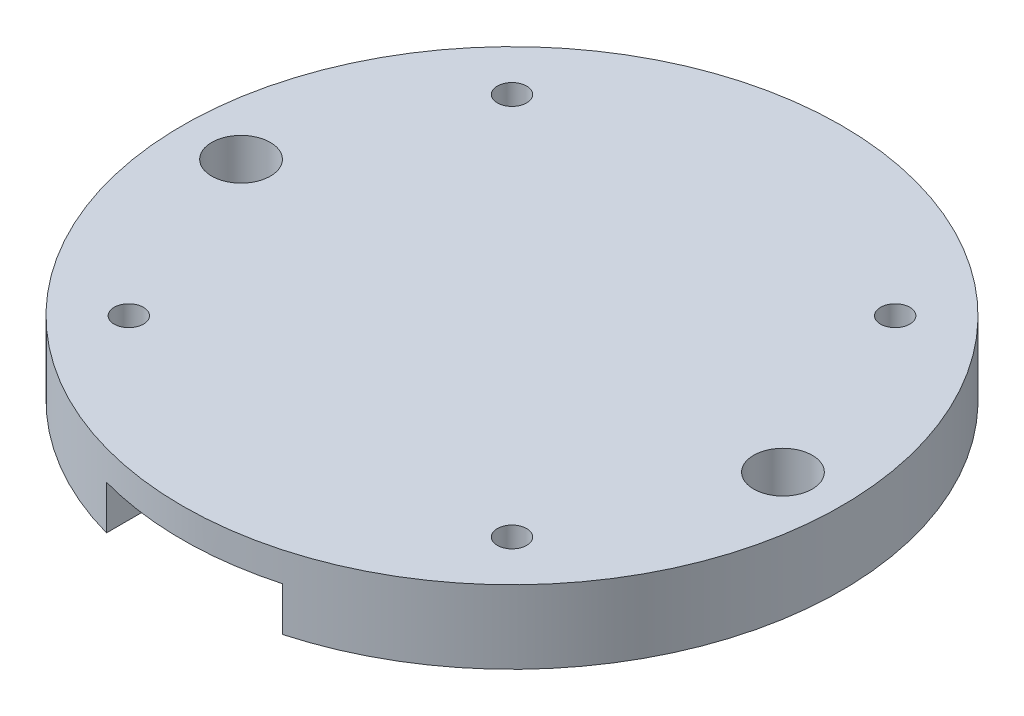
ISO-10303-21;
HEADER;
FILE_DESCRIPTION(('STEP AP214'),'2;1');
FILE_NAME('part.step','',(''),(''),'','','');
FILE_SCHEMA(('AUTOMOTIVE_DESIGN { 1 0 10303 214 1 1 1 1 }'));
ENDSEC;
DATA;
#1=APPLICATION_CONTEXT('core data for automotive mechanical design processes');
#2=APPLICATION_PROTOCOL_DEFINITION('international standard','automotive_design',2000,#1);
#3=PRODUCT_CONTEXT('',#1,'mechanical');
#4=PRODUCT('Part','Part','',(#3));
#5=PRODUCT_RELATED_PRODUCT_CATEGORY('part','',(#4));
#6=PRODUCT_DEFINITION_FORMATION('','',#4);
#7=PRODUCT_DEFINITION_CONTEXT('part definition',#1,'design');
#8=PRODUCT_DEFINITION('design','',#6,#7);
#9=PRODUCT_DEFINITION_SHAPE('','',#8);
#10=(LENGTH_UNIT() NAMED_UNIT(*) SI_UNIT(.MILLI.,.METRE.));
#11=(NAMED_UNIT(*) PLANE_ANGLE_UNIT() SI_UNIT($,.RADIAN.));
#12=(NAMED_UNIT(*) SI_UNIT($,.STERADIAN.) SOLID_ANGLE_UNIT());
#13=UNCERTAINTY_MEASURE_WITH_UNIT(LENGTH_MEASURE(1.E-05),#10,'distance_accuracy_value','');
#14=(GEOMETRIC_REPRESENTATION_CONTEXT(3) GLOBAL_UNCERTAINTY_ASSIGNED_CONTEXT((#13)) GLOBAL_UNIT_ASSIGNED_CONTEXT((#10,
#11,#12)) REPRESENTATION_CONTEXT('',''));
#15=CARTESIAN_POINT('',(0.,0.,0.));
#16=DIRECTION('',(0.,0.,1.));
#17=DIRECTION('',(1.,0.,0.));
#18=AXIS2_PLACEMENT_3D('',#15,#16,#17);
#19=CARTESIAN_POINT('',(0.,0.,0.));
#20=DIRECTION('',(0.,1.,0.));
#21=DIRECTION('',(0.,0.,1.));
#22=AXIS2_PLACEMENT_3D('',#19,#20,#21);
#23=PLANE('',#22);
#24=CARTESIAN_POINT('',(13.0814754519511,0.,13.0814754519512));
#25=DIRECTION('',(0.,1.,0.));
#26=DIRECTION('',(0.,0.,-1.));
#27=AXIS2_PLACEMENT_3D('',#24,#25,#26);
#28=CIRCLE('',#27,1.00000000000002);
#29=CARTESIAN_POINT('',(13.0814754519511,0.,14.0814754519512));
#30=VERTEX_POINT('',#29);
#31=EDGE_CURVE('E227',#30,#30,#28,.T.);
#32=ORIENTED_EDGE('',*,*,#31,.T.);
#33=EDGE_LOOP('',(#32));
#34=FACE_BOUND('',#33,.T.);
#35=CARTESIAN_POINT('',(13.0814754519511,0.,-13.0814754519512));
#36=DIRECTION('',(0.,1.,0.));
#37=DIRECTION('',(0.,0.,1.));
#38=AXIS2_PLACEMENT_3D('',#35,#36,#37);
#39=CIRCLE('',#38,1.00000000000002);
#40=CARTESIAN_POINT('',(13.0814754519511,0.,-12.0814754519511));
#41=VERTEX_POINT('',#40);
#42=EDGE_CURVE('E146',#41,#41,#39,.T.);
#43=ORIENTED_EDGE('',*,*,#42,.T.);
#44=EDGE_LOOP('',(#43));
#45=FACE_BOUND('',#44,.T.);
#46=CARTESIAN_POINT('',(18.5,0.,0.));
#47=DIRECTION('',(0.,1.,0.));
#48=DIRECTION('',(0.,0.,1.));
#49=AXIS2_PLACEMENT_3D('',#46,#47,#48);
#50=CIRCLE('',#49,2.);
#51=CARTESIAN_POINT('',(18.5,0.,2.));
#52=VERTEX_POINT('',#51);
#53=EDGE_CURVE('E125',#52,#52,#50,.T.);
#54=ORIENTED_EDGE('',*,*,#53,.T.);
#55=EDGE_LOOP('',(#54));
#56=FACE_BOUND('',#55,.T.);
#57=CARTESIAN_POINT('',(0.,0.,0.));
#58=DIRECTION('',(0.,1.,0.));
#59=DIRECTION('',(0.,0.,1.));
#60=AXIS2_PLACEMENT_3D('',#57,#58,#59);
#61=CIRCLE('',#60,22.5);
#62=CARTESIAN_POINT('',(6.,0.,21.6852484422014));
#63=VERTEX_POINT('',#62);
#64=CARTESIAN_POINT('',(6.,0.,-21.6852484422014));
#65=VERTEX_POINT('',#64);
#66=EDGE_CURVE('E119',#63,#65,#61,.T.);
#67=ORIENTED_EDGE('',*,*,#66,.F.);
#68=DIRECTION('',(0.,0.,1.));
#69=VECTOR('',#68,1.);
#70=CARTESIAN_POINT('',(6.,0.,-22.5));
#71=LINE('',#70,#69);
#72=CARTESIAN_POINT('',(6.,0.,8.31038506929733));
#73=VERTEX_POINT('',#72);
#74=EDGE_CURVE('E107',#73,#63,#71,.T.);
#75=ORIENTED_EDGE('',*,*,#74,.F.);
#76=CARTESIAN_POINT('',(0.,0.,0.));
#77=DIRECTION('',(0.,1.,0.));
#78=DIRECTION('',(0.,0.,1.));
#79=AXIS2_PLACEMENT_3D('',#76,#77,#78);
#80=CIRCLE('',#79,10.25);
#81=CARTESIAN_POINT('',(6.,0.,-8.31038506929733));
#82=VERTEX_POINT('',#81);
#83=EDGE_CURVE('E165',#73,#82,#80,.T.);
#84=ORIENTED_EDGE('',*,*,#83,.T.);
#85=EDGE_CURVE('E151',#65,#82,#71,.T.);
#86=ORIENTED_EDGE('',*,*,#85,.F.);
#87=EDGE_LOOP('',(#67,#75,#84,#86));
#88=FACE_BOUND('',#87,.T.);
#89=ADVANCED_FACE('F32',(#34,#45,#56,#88),#23,.F.);
#90=CARTESIAN_POINT('',(0.,1.,0.));
#91=DIRECTION('',(0.,-1.,0.));
#92=DIRECTION('',(0.,0.,-1.));
#93=AXIS2_PLACEMENT_3D('',#90,#91,#92);
#94=CYLINDRICAL_SURFACE('',#93,10.25);
#95=DIRECTION('',(0.,-1.,0.));
#96=VECTOR('',#95,1.);
#97=CARTESIAN_POINT('',(6.,1.,8.31038506929733));
#98=LINE('',#97,#96);
#99=CARTESIAN_POINT('',(6.,1.,8.31038506929733));
#100=VERTEX_POINT('',#99);
#101=EDGE_CURVE('E155',#100,#73,#98,.T.);
#102=ORIENTED_EDGE('',*,*,#101,.F.);
#103=CARTESIAN_POINT('',(0.,1.,0.));
#104=DIRECTION('',(0.,1.,0.));
#105=DIRECTION('',(0.,0.,1.));
#106=AXIS2_PLACEMENT_3D('',#103,#104,#105);
#107=CIRCLE('',#106,10.25);
#108=CARTESIAN_POINT('',(6.,1.,-8.31038506929733));
#109=VERTEX_POINT('',#108);
#110=EDGE_CURVE('E161',#100,#109,#107,.T.);
#111=ORIENTED_EDGE('',*,*,#110,.T.);
#112=DIRECTION('',(0.,-1.,0.));
#113=VECTOR('',#112,1.);
#114=CARTESIAN_POINT('',(6.,1.,-8.31038506929733));
#115=LINE('',#114,#113);
#116=EDGE_CURVE('E55',#82,#109,#115,.F.);
#117=ORIENTED_EDGE('',*,*,#116,.F.);
#118=ORIENTED_EDGE('',*,*,#83,.F.);
#119=EDGE_LOOP('',(#102,#111,#117,#118));
#120=FACE_BOUND('',#119,.T.);
#121=ADVANCED_FACE('F193',(#120),#94,.F.);
#122=CARTESIAN_POINT('',(0.,1.,0.));
#123=DIRECTION('',(0.,1.,0.));
#124=DIRECTION('',(0.,0.,1.));
#125=AXIS2_PLACEMENT_3D('',#122,#123,#124);
#126=PLANE('',#125);
#127=ORIENTED_EDGE('',*,*,#110,.F.);
#128=DIRECTION('',(0.,0.,-1.));
#129=VECTOR('',#128,1.);
#130=CARTESIAN_POINT('',(6.,1.,0.));
#131=LINE('',#130,#129);
#132=EDGE_CURVE('E131',#100,#109,#131,.T.);
#133=ORIENTED_EDGE('',*,*,#132,.T.);
#134=EDGE_LOOP('',(#127,#133));
#135=FACE_BOUND('',#134,.T.);
#136=ADVANCED_FACE('F198',(#135),#126,.F.);
#137=CARTESIAN_POINT('',(-13.0814754519511,0.,13.0814754519512));
#138=DIRECTION('',(0.,1.,0.));
#139=DIRECTION('',(0.,0.,1.));
#140=AXIS2_PLACEMENT_3D('',#137,#138,#139);
#141=CIRCLE('',#140,1.00000000000002);
#142=CARTESIAN_POINT('',(-13.0814754519511,0.,14.0814754519512));
#143=VERTEX_POINT('',#142);
#144=EDGE_CURVE('E215',#143,#143,#141,.T.);
#145=ORIENTED_EDGE('',*,*,#144,.T.);
#146=EDGE_LOOP('',(#145));
#147=FACE_BOUND('',#146,.T.);
#148=CARTESIAN_POINT('',(-13.0814754519511,0.,-13.0814754519512));
#149=DIRECTION('',(0.,1.,0.));
#150=DIRECTION('',(0.,0.,-1.));
#151=AXIS2_PLACEMENT_3D('',#148,#149,#150);
#152=CIRCLE('',#151,1.00000000000002);
#153=CARTESIAN_POINT('',(-13.0814754519511,0.,-12.0814754519511));
#154=VERTEX_POINT('',#153);
#155=EDGE_CURVE('E219',#154,#154,#152,.T.);
#156=ORIENTED_EDGE('',*,*,#155,.T.);
#157=EDGE_LOOP('',(#156));
#158=FACE_BOUND('',#157,.T.);
#159=CARTESIAN_POINT('',(-18.5,0.,0.));
#160=DIRECTION('',(0.,1.,0.));
#161=DIRECTION('',(0.,0.,-1.));
#162=AXIS2_PLACEMENT_3D('',#159,#160,#161);
#163=CIRCLE('',#162,2.);
#164=CARTESIAN_POINT('',(-18.5,0.,-2.));
#165=VERTEX_POINT('',#164);
#166=EDGE_CURVE('E163',#165,#165,#163,.T.);
#167=ORIENTED_EDGE('',*,*,#166,.T.);
#168=EDGE_LOOP('',(#167));
#169=FACE_BOUND('',#168,.T.);
#170=CARTESIAN_POINT('',(-6.,0.,-21.6852484422014));
#171=VERTEX_POINT('',#170);
#172=CARTESIAN_POINT('',(-6.,0.,21.6852484422014));
#173=VERTEX_POINT('',#172);
#174=EDGE_CURVE('E113',#171,#173,#61,.T.);
#175=ORIENTED_EDGE('',*,*,#174,.F.);
#176=DIRECTION('',(0.,0.,1.));
#177=VECTOR('',#176,1.);
#178=CARTESIAN_POINT('',(-6.,0.,-22.5));
#179=LINE('',#178,#177);
#180=CARTESIAN_POINT('',(-6.,0.,-8.31038506929734));
#181=VERTEX_POINT('',#180);
#182=EDGE_CURVE('E95',#171,#181,#179,.T.);
#183=ORIENTED_EDGE('',*,*,#182,.T.);
#184=CARTESIAN_POINT('',(-6.,0.,8.31038506929733));
#185=VERTEX_POINT('',#184);
#186=EDGE_CURVE('E160',#181,#185,#80,.T.);
#187=ORIENTED_EDGE('',*,*,#186,.T.);
#188=EDGE_CURVE('E108',#185,#173,#179,.T.);
#189=ORIENTED_EDGE('',*,*,#188,.T.);
#190=EDGE_LOOP('',(#175,#183,#187,#189));
#191=FACE_BOUND('',#190,.T.);
#192=ADVANCED_FACE('F118',(#147,#158,#169,#191),#23,.F.);
#193=CARTESIAN_POINT('',(0.,5.,0.));
#194=DIRECTION('',(0.,1.,0.));
#195=DIRECTION('',(0.,0.,1.));
#196=AXIS2_PLACEMENT_3D('',#193,#194,#195);
#197=PLANE('',#196);
#198=CARTESIAN_POINT('',(-13.0814754519511,5.,13.0814754519512));
#199=DIRECTION('',(0.,1.,0.));
#200=DIRECTION('',(0.,0.,1.));
#201=AXIS2_PLACEMENT_3D('',#198,#199,#200);
#202=CIRCLE('',#201,1.00000000000002);
#203=CARTESIAN_POINT('',(-13.0814754519511,5.,14.0814754519512));
#204=VERTEX_POINT('',#203);
#205=EDGE_CURVE('E232',#204,#204,#202,.T.);
#206=ORIENTED_EDGE('',*,*,#205,.F.);
#207=EDGE_LOOP('',(#206));
#208=FACE_BOUND('',#207,.T.);
#209=CARTESIAN_POINT('',(-13.0814754519511,5.,-13.0814754519512));
#210=DIRECTION('',(0.,1.,0.));
#211=DIRECTION('',(0.,0.,-1.));
#212=AXIS2_PLACEMENT_3D('',#209,#210,#211);
#213=CIRCLE('',#212,1.00000000000002);
#214=CARTESIAN_POINT('',(-13.0814754519511,5.,-12.0814754519511));
#215=VERTEX_POINT('',#214);
#216=EDGE_CURVE('E224',#215,#215,#213,.T.);
#217=ORIENTED_EDGE('',*,*,#216,.F.);
#218=EDGE_LOOP('',(#217));
#219=FACE_BOUND('',#218,.T.);
#220=CARTESIAN_POINT('',(13.0814754519511,5.,13.0814754519512));
#221=DIRECTION('',(0.,1.,0.));
#222=DIRECTION('',(0.,0.,-1.));
#223=AXIS2_PLACEMENT_3D('',#220,#221,#222);
#224=CIRCLE('',#223,1.00000000000002);
#225=CARTESIAN_POINT('',(13.0814754519511,5.,14.0814754519512));
#226=VERTEX_POINT('',#225);
#227=EDGE_CURVE('E223',#226,#226,#224,.T.);
#228=ORIENTED_EDGE('',*,*,#227,.F.);
#229=EDGE_LOOP('',(#228));
#230=FACE_BOUND('',#229,.T.);
#231=CARTESIAN_POINT('',(13.0814754519511,5.,-13.0814754519512));
#232=DIRECTION('',(0.,1.,0.));
#233=DIRECTION('',(0.,0.,1.));
#234=AXIS2_PLACEMENT_3D('',#231,#232,#233);
#235=CIRCLE('',#234,1.00000000000002);
#236=CARTESIAN_POINT('',(13.0814754519511,5.,-12.0814754519511));
#237=VERTEX_POINT('',#236);
#238=EDGE_CURVE('E235',#237,#237,#235,.T.);
#239=ORIENTED_EDGE('',*,*,#238,.F.);
#240=EDGE_LOOP('',(#239));
#241=FACE_BOUND('',#240,.T.);
#242=CARTESIAN_POINT('',(18.5,5.,0.));
#243=DIRECTION('',(0.,1.,0.));
#244=DIRECTION('',(0.,0.,1.));
#245=AXIS2_PLACEMENT_3D('',#242,#243,#244);
#246=CIRCLE('',#245,2.);
#247=CARTESIAN_POINT('',(18.5,5.,2.));
#248=VERTEX_POINT('',#247);
#249=EDGE_CURVE('E120',#248,#248,#246,.T.);
#250=ORIENTED_EDGE('',*,*,#249,.F.);
#251=EDGE_LOOP('',(#250));
#252=FACE_BOUND('',#251,.T.);
#253=CARTESIAN_POINT('',(0.,5.,0.));
#254=DIRECTION('',(0.,1.,0.));
#255=DIRECTION('',(0.,0.,1.));
#256=AXIS2_PLACEMENT_3D('',#253,#254,#255);
#257=CIRCLE('',#256,22.5);
#258=CARTESIAN_POINT('',(0.,5.,22.5));
#259=VERTEX_POINT('',#258);
#260=EDGE_CURVE('E123',#259,#259,#257,.T.);
#261=ORIENTED_EDGE('',*,*,#260,.T.);
#262=EDGE_LOOP('',(#261));
#263=FACE_BOUND('',#262,.T.);
#264=CARTESIAN_POINT('',(-18.5,5.,0.));
#265=DIRECTION('',(0.,1.,0.));
#266=DIRECTION('',(0.,0.,-1.));
#267=AXIS2_PLACEMENT_3D('',#264,#265,#266);
#268=CIRCLE('',#267,2.);
#269=CARTESIAN_POINT('',(-18.5,5.,-2.));
#270=VERTEX_POINT('',#269);
#271=EDGE_CURVE('E168',#270,#270,#268,.T.);
#272=ORIENTED_EDGE('',*,*,#271,.F.);
#273=EDGE_LOOP('',(#272));
#274=FACE_BOUND('',#273,.T.);
#275=ADVANCED_FACE('F189',(#208,#219,#230,#241,#252,#263,#274),#197,.T.);
#276=CARTESIAN_POINT('',(0.,5.,0.));
#277=DIRECTION('',(0.,-1.,0.));
#278=DIRECTION('',(0.,0.,-1.));
#279=AXIS2_PLACEMENT_3D('',#276,#277,#278);
#280=CYLINDRICAL_SURFACE('',#279,22.5);
#281=ORIENTED_EDGE('',*,*,#260,.F.);
#282=EDGE_LOOP('',(#281));
#283=FACE_BOUND('',#282,.T.);
#284=ORIENTED_EDGE('',*,*,#174,.T.);
#285=DIRECTION('',(0.,-1.,0.));
#286=VECTOR('',#285,1.);
#287=CARTESIAN_POINT('',(-6.,5.,21.6852484422014));
#288=LINE('',#287,#286);
#289=CARTESIAN_POINT('',(-5.99999999999999,3.,21.6852484422014));
#290=VERTEX_POINT('',#289);
#291=EDGE_CURVE('E115',#173,#290,#288,.F.);
#292=ORIENTED_EDGE('',*,*,#291,.T.);
#293=CARTESIAN_POINT('',(0.,3.,0.));
#294=DIRECTION('',(0.,1.,0.));
#295=DIRECTION('',(-1.,0.,0.));
#296=AXIS2_PLACEMENT_3D('',#293,#294,#295);
#297=CIRCLE('',#296,22.5);
#298=CARTESIAN_POINT('',(6.,3.,21.6852484422014));
#299=VERTEX_POINT('',#298);
#300=EDGE_CURVE('E36',#290,#299,#297,.T.);
#301=ORIENTED_EDGE('',*,*,#300,.T.);
#302=DIRECTION('',(0.,-1.,0.));
#303=VECTOR('',#302,1.);
#304=CARTESIAN_POINT('',(6.,5.,21.6852484422014));
#305=LINE('',#304,#303);
#306=EDGE_CURVE('E137',#299,#63,#305,.T.);
#307=ORIENTED_EDGE('',*,*,#306,.T.);
#308=ORIENTED_EDGE('',*,*,#66,.T.);
#309=DIRECTION('',(0.,-1.,0.));
#310=VECTOR('',#309,1.);
#311=CARTESIAN_POINT('',(6.,5.,-21.6852484422014));
#312=LINE('',#311,#310);
#313=CARTESIAN_POINT('',(6.,3.,-21.6852484422014));
#314=VERTEX_POINT('',#313);
#315=EDGE_CURVE('E157',#65,#314,#312,.F.);
#316=ORIENTED_EDGE('',*,*,#315,.T.);
#317=CARTESIAN_POINT('',(-5.99999999999999,3.,-21.6852484422014));
#318=VERTEX_POINT('',#317);
#319=EDGE_CURVE('E11',#314,#318,#297,.T.);
#320=ORIENTED_EDGE('',*,*,#319,.T.);
#321=DIRECTION('',(0.,-1.,0.));
#322=VECTOR('',#321,1.);
#323=CARTESIAN_POINT('',(-6.,5.,-21.6852484422014));
#324=LINE('',#323,#322);
#325=EDGE_CURVE('E99',#318,#171,#324,.T.);
#326=ORIENTED_EDGE('',*,*,#325,.T.);
#327=EDGE_LOOP('',(#284,#292,#301,#307,#308,#316,#320,#326));
#328=FACE_BOUND('',#327,.T.);
#329=ADVANCED_FACE('F34',(#283,#328),#280,.T.);
#330=CARTESIAN_POINT('',(18.5,5.,0.));
#331=DIRECTION('',(0.,-1.,0.));
#332=DIRECTION('',(0.,0.,-1.));
#333=AXIS2_PLACEMENT_3D('',#330,#331,#332);
#334=CYLINDRICAL_SURFACE('',#333,2.);
#335=ORIENTED_EDGE('',*,*,#249,.T.);
#336=EDGE_LOOP('',(#335));
#337=FACE_BOUND('',#336,.T.);
#338=ORIENTED_EDGE('',*,*,#53,.F.);
#339=EDGE_LOOP('',(#338));
#340=FACE_BOUND('',#339,.T.);
#341=ADVANCED_FACE('F177',(#337,#340),#334,.F.);
#342=CARTESIAN_POINT('',(-18.5,5.,0.));
#343=DIRECTION('',(0.,-1.,0.));
#344=DIRECTION('',(0.,0.,-1.));
#345=AXIS2_PLACEMENT_3D('',#342,#343,#344);
#346=CYLINDRICAL_SURFACE('',#345,2.);
#347=ORIENTED_EDGE('',*,*,#271,.T.);
#348=EDGE_LOOP('',(#347));
#349=FACE_BOUND('',#348,.T.);
#350=ORIENTED_EDGE('',*,*,#166,.F.);
#351=EDGE_LOOP('',(#350));
#352=FACE_BOUND('',#351,.T.);
#353=ADVANCED_FACE('F179',(#349,#352),#346,.F.);
#354=DIRECTION('',(0.,-1.,0.));
#355=VECTOR('',#354,1.);
#356=CARTESIAN_POINT('',(-6.,1.,-8.31038506929733));
#357=LINE('',#356,#355);
#358=CARTESIAN_POINT('',(-6.,1.,-8.31038506929733));
#359=VERTEX_POINT('',#358);
#360=EDGE_CURVE('E102',#359,#181,#357,.T.);
#361=ORIENTED_EDGE('',*,*,#360,.F.);
#362=CARTESIAN_POINT('',(-6.,1.,8.31038506929733));
#363=VERTEX_POINT('',#362);
#364=EDGE_CURVE('E164',#359,#363,#107,.T.);
#365=ORIENTED_EDGE('',*,*,#364,.T.);
#366=DIRECTION('',(0.,-1.,0.));
#367=VECTOR('',#366,1.);
#368=CARTESIAN_POINT('',(-6.,1.,8.31038506929733));
#369=LINE('',#368,#367);
#370=EDGE_CURVE('E47',#185,#363,#369,.F.);
#371=ORIENTED_EDGE('',*,*,#370,.F.);
#372=ORIENTED_EDGE('',*,*,#186,.F.);
#373=EDGE_LOOP('',(#361,#365,#371,#372));
#374=FACE_BOUND('',#373,.T.);
#375=ADVANCED_FACE('F186',(#374),#94,.F.);
#376=ORIENTED_EDGE('',*,*,#364,.F.);
#377=DIRECTION('',(0.,0.,1.));
#378=VECTOR('',#377,1.);
#379=CARTESIAN_POINT('',(-6.,1.,0.));
#380=LINE('',#379,#378);
#381=EDGE_CURVE('E130',#359,#363,#380,.T.);
#382=ORIENTED_EDGE('',*,*,#381,.T.);
#383=EDGE_LOOP('',(#376,#382));
#384=FACE_BOUND('',#383,.T.);
#385=ADVANCED_FACE('F211',(#384),#126,.F.);
#386=CARTESIAN_POINT('',(-6.,3.,-22.5));
#387=DIRECTION('',(0.,1.,0.));
#388=DIRECTION('',(-1.,0.,0.));
#389=AXIS2_PLACEMENT_3D('',#386,#387,#388);
#390=PLANE('',#389);
#391=DIRECTION('',(0.,0.,1.));
#392=VECTOR('',#391,1.);
#393=CARTESIAN_POINT('',(-6.,3.,-22.5));
#394=LINE('',#393,#392);
#395=EDGE_CURVE('E142',#318,#290,#394,.T.);
#396=ORIENTED_EDGE('',*,*,#395,.F.);
#397=ORIENTED_EDGE('',*,*,#319,.F.);
#398=DIRECTION('',(0.,0.,1.));
#399=VECTOR('',#398,1.);
#400=CARTESIAN_POINT('',(6.,3.,-22.5));
#401=LINE('',#400,#399);
#402=EDGE_CURVE('E144',#314,#299,#401,.T.);
#403=ORIENTED_EDGE('',*,*,#402,.T.);
#404=ORIENTED_EDGE('',*,*,#300,.F.);
#405=EDGE_LOOP('',(#396,#397,#403,#404));
#406=FACE_BOUND('',#405,.T.);
#407=ADVANCED_FACE('F141',(#406),#390,.F.);
#408=CARTESIAN_POINT('',(6.,0.,-22.5));
#409=DIRECTION('',(1.,0.,0.));
#410=DIRECTION('',(0.,0.,-1.));
#411=AXIS2_PLACEMENT_3D('',#408,#409,#410);
#412=PLANE('',#411);
#413=ORIENTED_EDGE('',*,*,#402,.F.);
#414=ORIENTED_EDGE('',*,*,#315,.F.);
#415=ORIENTED_EDGE('',*,*,#85,.T.);
#416=ORIENTED_EDGE('',*,*,#116,.T.);
#417=ORIENTED_EDGE('',*,*,#132,.F.);
#418=ORIENTED_EDGE('',*,*,#101,.T.);
#419=ORIENTED_EDGE('',*,*,#74,.T.);
#420=ORIENTED_EDGE('',*,*,#306,.F.);
#421=EDGE_LOOP('',(#413,#414,#415,#416,#417,#418,#419,#420));
#422=FACE_BOUND('',#421,.T.);
#423=ADVANCED_FACE('F242',(#422),#412,.F.);
#424=CARTESIAN_POINT('',(-6.,0.,-22.5));
#425=DIRECTION('',(-1.,0.,0.));
#426=DIRECTION('',(0.,0.,1.));
#427=AXIS2_PLACEMENT_3D('',#424,#425,#426);
#428=PLANE('',#427);
#429=ORIENTED_EDGE('',*,*,#395,.T.);
#430=ORIENTED_EDGE('',*,*,#291,.F.);
#431=ORIENTED_EDGE('',*,*,#188,.F.);
#432=ORIENTED_EDGE('',*,*,#370,.T.);
#433=ORIENTED_EDGE('',*,*,#381,.F.);
#434=ORIENTED_EDGE('',*,*,#360,.T.);
#435=ORIENTED_EDGE('',*,*,#182,.F.);
#436=ORIENTED_EDGE('',*,*,#325,.F.);
#437=EDGE_LOOP('',(#429,#430,#431,#432,#433,#434,#435,#436));
#438=FACE_BOUND('',#437,.T.);
#439=ADVANCED_FACE('F98',(#438),#428,.F.);
#440=CARTESIAN_POINT('',(13.0814754519511,0.,-13.0814754519512));
#441=DIRECTION('',(0.,1.,0.));
#442=DIRECTION('',(0.,0.,1.));
#443=AXIS2_PLACEMENT_3D('',#440,#441,#442);
#444=CYLINDRICAL_SURFACE('',#443,1.00000000000002);
#445=CARTESIAN_POINT('',(13.0814754519511,0.,-12.0814754519511));
#446=CARTESIAN_POINT('',(13.0814754519511,0.0520833333333316,-12.0814754519511));
#447=CARTESIAN_POINT('',(13.0814754519511,0.104166666666665,-12.0814754519511));
#448=CARTESIAN_POINT('',(13.0814754519511,0.208333333333332,-12.0814754519511));
#449=CARTESIAN_POINT('',(13.0814754519511,0.260416666666665,-12.0814754519511));
#450=CARTESIAN_POINT('',(13.0814754519511,0.364583333333332,-12.0814754519511));
#451=CARTESIAN_POINT('',(13.0814754519511,0.416666666666665,-12.0814754519511));
#452=CARTESIAN_POINT('',(13.0814754519511,0.520833333333332,-12.0814754519511));
#453=CARTESIAN_POINT('',(13.0814754519511,0.572916666666665,-12.0814754519511));
#454=CARTESIAN_POINT('',(13.0814754519511,0.677083333333332,-12.0814754519511));
#455=CARTESIAN_POINT('',(13.0814754519511,0.729166666666665,-12.0814754519511));
#456=CARTESIAN_POINT('',(13.0814754519511,0.833333333333332,-12.0814754519511));
#457=CARTESIAN_POINT('',(13.0814754519511,0.885416666666665,-12.0814754519511));
#458=CARTESIAN_POINT('',(13.0814754519511,0.989583333333332,-12.0814754519511));
#459=CARTESIAN_POINT('',(13.0814754519511,1.04166666666667,-12.0814754519511));
#460=CARTESIAN_POINT('',(13.0814754519511,1.14583333333333,-12.0814754519511));
#461=CARTESIAN_POINT('',(13.0814754519511,1.19791666666667,-12.0814754519511));
#462=CARTESIAN_POINT('',(13.0814754519511,1.30208333333333,-12.0814754519511));
#463=CARTESIAN_POINT('',(13.0814754519511,1.35416666666667,-12.0814754519511));
#464=CARTESIAN_POINT('',(13.0814754519511,1.45833333333333,-12.0814754519511));
#465=CARTESIAN_POINT('',(13.0814754519511,1.51041666666667,-12.0814754519511));
#466=CARTESIAN_POINT('',(13.0814754519511,1.61458333333333,-12.0814754519511));
#467=CARTESIAN_POINT('',(13.0814754519511,1.66666666666667,-12.0814754519511));
#468=CARTESIAN_POINT('',(13.0814754519511,1.77083333333333,-12.0814754519511));
#469=CARTESIAN_POINT('',(13.0814754519511,1.82291666666667,-12.0814754519511));
#470=CARTESIAN_POINT('',(13.0814754519511,1.92708333333333,-12.0814754519511));
#471=CARTESIAN_POINT('',(13.0814754519511,1.97916666666667,-12.0814754519511));
#472=CARTESIAN_POINT('',(13.0814754519511,2.08333333333333,-12.0814754519511));
#473=CARTESIAN_POINT('',(13.0814754519511,2.13541666666667,-12.0814754519511));
#474=CARTESIAN_POINT('',(13.0814754519511,2.23958333333333,-12.0814754519511));
#475=CARTESIAN_POINT('',(13.0814754519511,2.29166666666667,-12.0814754519511));
#476=CARTESIAN_POINT('',(13.0814754519511,2.39583333333333,-12.0814754519511));
#477=CARTESIAN_POINT('',(13.0814754519511,2.44791666666667,-12.0814754519511));
#478=CARTESIAN_POINT('',(13.0814754519511,2.55208333333333,-12.0814754519511));
#479=CARTESIAN_POINT('',(13.0814754519511,2.60416666666667,-12.0814754519511));
#480=CARTESIAN_POINT('',(13.0814754519511,2.70833333333333,-12.0814754519511));
#481=CARTESIAN_POINT('',(13.0814754519511,2.76041666666667,-12.0814754519511));
#482=CARTESIAN_POINT('',(13.0814754519511,2.86458333333333,-12.0814754519511));
#483=CARTESIAN_POINT('',(13.0814754519511,2.91666666666667,-12.0814754519511));
#484=CARTESIAN_POINT('',(13.0814754519511,3.02083333333333,-12.0814754519511));
#485=CARTESIAN_POINT('',(13.0814754519511,3.07291666666667,-12.0814754519511));
#486=CARTESIAN_POINT('',(13.0814754519511,3.17708333333333,-12.0814754519511));
#487=CARTESIAN_POINT('',(13.0814754519511,3.22916666666667,-12.0814754519511));
#488=CARTESIAN_POINT('',(13.0814754519511,3.33333333333333,-12.0814754519511));
#489=CARTESIAN_POINT('',(13.0814754519511,3.38541666666667,-12.0814754519511));
#490=CARTESIAN_POINT('',(13.0814754519511,3.48958333333333,-12.0814754519511));
#491=CARTESIAN_POINT('',(13.0814754519511,3.54166666666667,-12.0814754519511));
#492=CARTESIAN_POINT('',(13.0814754519511,3.64583333333333,-12.0814754519511));
#493=CARTESIAN_POINT('',(13.0814754519511,3.69791666666667,-12.0814754519511));
#494=CARTESIAN_POINT('',(13.0814754519511,3.80208333333333,-12.0814754519511));
#495=CARTESIAN_POINT('',(13.0814754519511,3.85416666666667,-12.0814754519511));
#496=CARTESIAN_POINT('',(13.0814754519511,3.95833333333333,-12.0814754519511));
#497=CARTESIAN_POINT('',(13.0814754519511,4.01041666666667,-12.0814754519511));
#498=CARTESIAN_POINT('',(13.0814754519511,4.11458333333333,-12.0814754519511));
#499=CARTESIAN_POINT('',(13.0814754519511,4.16666666666667,-12.0814754519511));
#500=CARTESIAN_POINT('',(13.0814754519511,4.27083333333333,-12.0814754519511));
#501=CARTESIAN_POINT('',(13.0814754519511,4.32291666666667,-12.0814754519511));
#502=CARTESIAN_POINT('',(13.0814754519511,4.42708333333333,-12.0814754519511));
#503=CARTESIAN_POINT('',(13.0814754519511,4.47916666666667,-12.0814754519511));
#504=CARTESIAN_POINT('',(13.0814754519511,4.58333333333333,-12.0814754519511));
#505=CARTESIAN_POINT('',(13.0814754519511,4.63541666666667,-12.0814754519511));
#506=CARTESIAN_POINT('',(13.0814754519511,4.73958333333333,-12.0814754519511));
#507=CARTESIAN_POINT('',(13.0814754519511,4.79166666666667,-12.0814754519511));
#508=CARTESIAN_POINT('',(13.0814754519511,4.89583333333333,-12.0814754519511));
#509=CARTESIAN_POINT('',(13.0814754519511,4.94791666666667,-12.0814754519511));
#510=CARTESIAN_POINT('',(13.0814754519511,5.,-12.0814754519511));
#511=B_SPLINE_CURVE_WITH_KNOTS('',3,(#445,#446,#447,#448,#449,#450,#451,#452,#453,#454,#455,
#456,#457,#458,#459,#460,#461,#462,#463,#464,#465,#466,#467,#468,#469,#470,#471,#472,#473,#474,
#475,#476,#477,#478,#479,#480,#481,#482,#483,#484,#485,#486,#487,#488,#489,#490,#491,#492,#493,
#494,#495,#496,#497,#498,#499,#500,#501,#502,#503,#504,#505,#506,#507,#508,#509,#510),
.UNSPECIFIED.,.F.,.F.,(4,2,2,2,2,2,2,2,2,2,2,2,2,2,2,2,2,2,2,2,2,2,2,2,2,2,2,2,2,2,2,2,4),(0.,
0.15625,0.3125,0.46875,0.625,0.78125,0.9375,1.09375,1.25,1.40625,1.5625,1.71875,1.875,2.03125,
2.1875,2.34375,2.5,2.65625,2.8125,2.96875,3.125,3.28125,3.4375,3.59375,3.75,3.90625,4.0625,
4.21875,4.375,4.53125,4.6875,4.84375,5.),.UNSPECIFIED.);
#512=EDGE_CURVE('BSEAM251',#41,#237,#511,.T.);
#513=ORIENTED_EDGE('',*,*,#42,.F.);
#514=ORIENTED_EDGE('',*,*,#238,.T.);
#515=ORIENTED_EDGE('',*,*,#512,.T.);
#516=ORIENTED_EDGE('',*,*,#512,.F.);
#517=EDGE_LOOP('',(#513,#515,#514,#516));
#518=FACE_BOUND('',#517,.T.);
#519=ADVANCED_FACE('F251',(#518),#444,.F.);
#520=CARTESIAN_POINT('',(13.0814754519511,0.,13.0814754519512));
#521=DIRECTION('',(0.,1.,0.));
#522=DIRECTION('',(0.,0.,1.));
#523=AXIS2_PLACEMENT_3D('',#520,#521,#522);
#524=CYLINDRICAL_SURFACE('',#523,1.00000000000002);
#525=CARTESIAN_POINT('',(13.0814754519511,0.,14.0814754519512));
#526=CARTESIAN_POINT('',(13.0814754519511,0.0520833333333316,14.0814754519512));
#527=CARTESIAN_POINT('',(13.0814754519511,0.104166666666665,14.0814754519512));
#528=CARTESIAN_POINT('',(13.0814754519511,0.208333333333332,14.0814754519512));
#529=CARTESIAN_POINT('',(13.0814754519511,0.260416666666665,14.0814754519512));
#530=CARTESIAN_POINT('',(13.0814754519511,0.364583333333332,14.0814754519512));
#531=CARTESIAN_POINT('',(13.0814754519511,0.416666666666665,14.0814754519512));
#532=CARTESIAN_POINT('',(13.0814754519511,0.520833333333332,14.0814754519512));
#533=CARTESIAN_POINT('',(13.0814754519511,0.572916666666665,14.0814754519512));
#534=CARTESIAN_POINT('',(13.0814754519511,0.677083333333332,14.0814754519512));
#535=CARTESIAN_POINT('',(13.0814754519511,0.729166666666665,14.0814754519512));
#536=CARTESIAN_POINT('',(13.0814754519511,0.833333333333332,14.0814754519512));
#537=CARTESIAN_POINT('',(13.0814754519511,0.885416666666665,14.0814754519512));
#538=CARTESIAN_POINT('',(13.0814754519511,0.989583333333332,14.0814754519512));
#539=CARTESIAN_POINT('',(13.0814754519511,1.04166666666667,14.0814754519512));
#540=CARTESIAN_POINT('',(13.0814754519511,1.14583333333333,14.0814754519512));
#541=CARTESIAN_POINT('',(13.0814754519511,1.19791666666667,14.0814754519512));
#542=CARTESIAN_POINT('',(13.0814754519511,1.30208333333333,14.0814754519512));
#543=CARTESIAN_POINT('',(13.0814754519511,1.35416666666667,14.0814754519512));
#544=CARTESIAN_POINT('',(13.0814754519511,1.45833333333333,14.0814754519512));
#545=CARTESIAN_POINT('',(13.0814754519511,1.51041666666667,14.0814754519512));
#546=CARTESIAN_POINT('',(13.0814754519511,1.61458333333333,14.0814754519512));
#547=CARTESIAN_POINT('',(13.0814754519511,1.66666666666667,14.0814754519512));
#548=CARTESIAN_POINT('',(13.0814754519511,1.77083333333333,14.0814754519512));
#549=CARTESIAN_POINT('',(13.0814754519511,1.82291666666667,14.0814754519512));
#550=CARTESIAN_POINT('',(13.0814754519511,1.92708333333333,14.0814754519512));
#551=CARTESIAN_POINT('',(13.0814754519511,1.97916666666667,14.0814754519512));
#552=CARTESIAN_POINT('',(13.0814754519511,2.08333333333333,14.0814754519512));
#553=CARTESIAN_POINT('',(13.0814754519511,2.13541666666667,14.0814754519512));
#554=CARTESIAN_POINT('',(13.0814754519511,2.23958333333333,14.0814754519512));
#555=CARTESIAN_POINT('',(13.0814754519511,2.29166666666667,14.0814754519512));
#556=CARTESIAN_POINT('',(13.0814754519511,2.39583333333333,14.0814754519512));
#557=CARTESIAN_POINT('',(13.0814754519511,2.44791666666667,14.0814754519512));
#558=CARTESIAN_POINT('',(13.0814754519511,2.55208333333333,14.0814754519512));
#559=CARTESIAN_POINT('',(13.0814754519511,2.60416666666667,14.0814754519512));
#560=CARTESIAN_POINT('',(13.0814754519511,2.70833333333333,14.0814754519512));
#561=CARTESIAN_POINT('',(13.0814754519511,2.76041666666667,14.0814754519512));
#562=CARTESIAN_POINT('',(13.0814754519511,2.86458333333333,14.0814754519512));
#563=CARTESIAN_POINT('',(13.0814754519511,2.91666666666667,14.0814754519512));
#564=CARTESIAN_POINT('',(13.0814754519511,3.02083333333333,14.0814754519512));
#565=CARTESIAN_POINT('',(13.0814754519511,3.07291666666667,14.0814754519512));
#566=CARTESIAN_POINT('',(13.0814754519511,3.17708333333333,14.0814754519512));
#567=CARTESIAN_POINT('',(13.0814754519511,3.22916666666667,14.0814754519512));
#568=CARTESIAN_POINT('',(13.0814754519511,3.33333333333333,14.0814754519512));
#569=CARTESIAN_POINT('',(13.0814754519511,3.38541666666667,14.0814754519512));
#570=CARTESIAN_POINT('',(13.0814754519511,3.48958333333333,14.0814754519512));
#571=CARTESIAN_POINT('',(13.0814754519511,3.54166666666667,14.0814754519512));
#572=CARTESIAN_POINT('',(13.0814754519511,3.64583333333333,14.0814754519512));
#573=CARTESIAN_POINT('',(13.0814754519511,3.69791666666667,14.0814754519512));
#574=CARTESIAN_POINT('',(13.0814754519511,3.80208333333333,14.0814754519512));
#575=CARTESIAN_POINT('',(13.0814754519511,3.85416666666667,14.0814754519512));
#576=CARTESIAN_POINT('',(13.0814754519511,3.95833333333333,14.0814754519512));
#577=CARTESIAN_POINT('',(13.0814754519511,4.01041666666667,14.0814754519512));
#578=CARTESIAN_POINT('',(13.0814754519511,4.11458333333333,14.0814754519512));
#579=CARTESIAN_POINT('',(13.0814754519511,4.16666666666667,14.0814754519512));
#580=CARTESIAN_POINT('',(13.0814754519511,4.27083333333333,14.0814754519512));
#581=CARTESIAN_POINT('',(13.0814754519511,4.32291666666667,14.0814754519512));
#582=CARTESIAN_POINT('',(13.0814754519511,4.42708333333333,14.0814754519512));
#583=CARTESIAN_POINT('',(13.0814754519511,4.47916666666667,14.0814754519512));
#584=CARTESIAN_POINT('',(13.0814754519511,4.58333333333333,14.0814754519512));
#585=CARTESIAN_POINT('',(13.0814754519511,4.63541666666667,14.0814754519512));
#586=CARTESIAN_POINT('',(13.0814754519511,4.73958333333333,14.0814754519512));
#587=CARTESIAN_POINT('',(13.0814754519511,4.79166666666667,14.0814754519512));
#588=CARTESIAN_POINT('',(13.0814754519511,4.89583333333333,14.0814754519512));
#589=CARTESIAN_POINT('',(13.0814754519511,4.94791666666667,14.0814754519512));
#590=CARTESIAN_POINT('',(13.0814754519511,5.,14.0814754519512));
#591=B_SPLINE_CURVE_WITH_KNOTS('',3,(#525,#526,#527,#528,#529,#530,#531,#532,#533,#534,#535,
#536,#537,#538,#539,#540,#541,#542,#543,#544,#545,#546,#547,#548,#549,#550,#551,#552,#553,#554,
#555,#556,#557,#558,#559,#560,#561,#562,#563,#564,#565,#566,#567,#568,#569,#570,#571,#572,#573,
#574,#575,#576,#577,#578,#579,#580,#581,#582,#583,#584,#585,#586,#587,#588,#589,#590),
.UNSPECIFIED.,.F.,.F.,(4,2,2,2,2,2,2,2,2,2,2,2,2,2,2,2,2,2,2,2,2,2,2,2,2,2,2,2,2,2,2,2,4),(0.,
0.15625,0.3125,0.46875,0.625,0.78125,0.9375,1.09375,1.25,1.40625,1.5625,1.71875,1.875,2.03125,
2.1875,2.34375,2.5,2.65625,2.8125,2.96875,3.125,3.28125,3.4375,3.59375,3.75,3.90625,4.0625,
4.21875,4.375,4.53125,4.6875,4.84375,5.),.UNSPECIFIED.);
#592=EDGE_CURVE('BSEAM309',#30,#226,#591,.T.);
#593=ORIENTED_EDGE('',*,*,#31,.F.);
#594=ORIENTED_EDGE('',*,*,#227,.T.);
#595=ORIENTED_EDGE('',*,*,#592,.T.);
#596=ORIENTED_EDGE('',*,*,#592,.F.);
#597=EDGE_LOOP('',(#593,#595,#594,#596));
#598=FACE_BOUND('',#597,.T.);
#599=ADVANCED_FACE('F309',(#598),#524,.F.);
#600=CARTESIAN_POINT('',(-13.0814754519511,0.,-13.0814754519512));
#601=DIRECTION('',(0.,1.,0.));
#602=DIRECTION('',(0.,0.,1.));
#603=AXIS2_PLACEMENT_3D('',#600,#601,#602);
#604=CYLINDRICAL_SURFACE('',#603,1.00000000000002);
#605=CARTESIAN_POINT('',(-13.0814754519511,0.,-12.0814754519511));
#606=CARTESIAN_POINT('',(-13.0814754519511,0.0520833333333316,-12.0814754519511));
#607=CARTESIAN_POINT('',(-13.0814754519511,0.104166666666665,-12.0814754519511));
#608=CARTESIAN_POINT('',(-13.0814754519511,0.208333333333332,-12.0814754519511));
#609=CARTESIAN_POINT('',(-13.0814754519511,0.260416666666665,-12.0814754519511));
#610=CARTESIAN_POINT('',(-13.0814754519511,0.364583333333332,-12.0814754519511));
#611=CARTESIAN_POINT('',(-13.0814754519511,0.416666666666665,-12.0814754519511));
#612=CARTESIAN_POINT('',(-13.0814754519511,0.520833333333332,-12.0814754519511));
#613=CARTESIAN_POINT('',(-13.0814754519511,0.572916666666665,-12.0814754519511));
#614=CARTESIAN_POINT('',(-13.0814754519511,0.677083333333332,-12.0814754519511));
#615=CARTESIAN_POINT('',(-13.0814754519511,0.729166666666665,-12.0814754519511));
#616=CARTESIAN_POINT('',(-13.0814754519511,0.833333333333332,-12.0814754519511));
#617=CARTESIAN_POINT('',(-13.0814754519511,0.885416666666665,-12.0814754519511));
#618=CARTESIAN_POINT('',(-13.0814754519511,0.989583333333332,-12.0814754519511));
#619=CARTESIAN_POINT('',(-13.0814754519511,1.04166666666667,-12.0814754519511));
#620=CARTESIAN_POINT('',(-13.0814754519511,1.14583333333333,-12.0814754519511));
#621=CARTESIAN_POINT('',(-13.0814754519511,1.19791666666667,-12.0814754519511));
#622=CARTESIAN_POINT('',(-13.0814754519511,1.30208333333333,-12.0814754519511));
#623=CARTESIAN_POINT('',(-13.0814754519511,1.35416666666667,-12.0814754519511));
#624=CARTESIAN_POINT('',(-13.0814754519511,1.45833333333333,-12.0814754519511));
#625=CARTESIAN_POINT('',(-13.0814754519511,1.51041666666667,-12.0814754519511));
#626=CARTESIAN_POINT('',(-13.0814754519511,1.61458333333333,-12.0814754519511));
#627=CARTESIAN_POINT('',(-13.0814754519511,1.66666666666667,-12.0814754519511));
#628=CARTESIAN_POINT('',(-13.0814754519511,1.77083333333333,-12.0814754519511));
#629=CARTESIAN_POINT('',(-13.0814754519511,1.82291666666667,-12.0814754519511));
#630=CARTESIAN_POINT('',(-13.0814754519511,1.92708333333333,-12.0814754519511));
#631=CARTESIAN_POINT('',(-13.0814754519511,1.97916666666667,-12.0814754519511));
#632=CARTESIAN_POINT('',(-13.0814754519511,2.08333333333333,-12.0814754519511));
#633=CARTESIAN_POINT('',(-13.0814754519511,2.13541666666667,-12.0814754519511));
#634=CARTESIAN_POINT('',(-13.0814754519511,2.23958333333333,-12.0814754519511));
#635=CARTESIAN_POINT('',(-13.0814754519511,2.29166666666667,-12.0814754519511));
#636=CARTESIAN_POINT('',(-13.0814754519511,2.39583333333333,-12.0814754519511));
#637=CARTESIAN_POINT('',(-13.0814754519511,2.44791666666667,-12.0814754519511));
#638=CARTESIAN_POINT('',(-13.0814754519511,2.55208333333333,-12.0814754519511));
#639=CARTESIAN_POINT('',(-13.0814754519511,2.60416666666667,-12.0814754519511));
#640=CARTESIAN_POINT('',(-13.0814754519511,2.70833333333333,-12.0814754519511));
#641=CARTESIAN_POINT('',(-13.0814754519511,2.76041666666667,-12.0814754519511));
#642=CARTESIAN_POINT('',(-13.0814754519511,2.86458333333333,-12.0814754519511));
#643=CARTESIAN_POINT('',(-13.0814754519511,2.91666666666667,-12.0814754519511));
#644=CARTESIAN_POINT('',(-13.0814754519511,3.02083333333333,-12.0814754519511));
#645=CARTESIAN_POINT('',(-13.0814754519511,3.07291666666667,-12.0814754519511));
#646=CARTESIAN_POINT('',(-13.0814754519511,3.17708333333333,-12.0814754519511));
#647=CARTESIAN_POINT('',(-13.0814754519511,3.22916666666667,-12.0814754519511));
#648=CARTESIAN_POINT('',(-13.0814754519511,3.33333333333333,-12.0814754519511));
#649=CARTESIAN_POINT('',(-13.0814754519511,3.38541666666667,-12.0814754519511));
#650=CARTESIAN_POINT('',(-13.0814754519511,3.48958333333333,-12.0814754519511));
#651=CARTESIAN_POINT('',(-13.0814754519511,3.54166666666667,-12.0814754519511));
#652=CARTESIAN_POINT('',(-13.0814754519511,3.64583333333333,-12.0814754519511));
#653=CARTESIAN_POINT('',(-13.0814754519511,3.69791666666667,-12.0814754519511));
#654=CARTESIAN_POINT('',(-13.0814754519511,3.80208333333333,-12.0814754519511));
#655=CARTESIAN_POINT('',(-13.0814754519511,3.85416666666667,-12.0814754519511));
#656=CARTESIAN_POINT('',(-13.0814754519511,3.95833333333333,-12.0814754519511));
#657=CARTESIAN_POINT('',(-13.0814754519511,4.01041666666667,-12.0814754519511));
#658=CARTESIAN_POINT('',(-13.0814754519511,4.11458333333333,-12.0814754519511));
#659=CARTESIAN_POINT('',(-13.0814754519511,4.16666666666667,-12.0814754519511));
#660=CARTESIAN_POINT('',(-13.0814754519511,4.27083333333333,-12.0814754519511));
#661=CARTESIAN_POINT('',(-13.0814754519511,4.32291666666667,-12.0814754519511));
#662=CARTESIAN_POINT('',(-13.0814754519511,4.42708333333333,-12.0814754519511));
#663=CARTESIAN_POINT('',(-13.0814754519511,4.47916666666667,-12.0814754519511));
#664=CARTESIAN_POINT('',(-13.0814754519511,4.58333333333333,-12.0814754519511));
#665=CARTESIAN_POINT('',(-13.0814754519511,4.63541666666667,-12.0814754519511));
#666=CARTESIAN_POINT('',(-13.0814754519511,4.73958333333333,-12.0814754519511));
#667=CARTESIAN_POINT('',(-13.0814754519511,4.79166666666667,-12.0814754519511));
#668=CARTESIAN_POINT('',(-13.0814754519511,4.89583333333333,-12.0814754519511));
#669=CARTESIAN_POINT('',(-13.0814754519511,4.94791666666667,-12.0814754519511));
#670=CARTESIAN_POINT('',(-13.0814754519511,5.,-12.0814754519511));
#671=B_SPLINE_CURVE_WITH_KNOTS('',3,(#605,#606,#607,#608,#609,#610,#611,#612,#613,#614,#615,
#616,#617,#618,#619,#620,#621,#622,#623,#624,#625,#626,#627,#628,#629,#630,#631,#632,#633,#634,
#635,#636,#637,#638,#639,#640,#641,#642,#643,#644,#645,#646,#647,#648,#649,#650,#651,#652,#653,
#654,#655,#656,#657,#658,#659,#660,#661,#662,#663,#664,#665,#666,#667,#668,#669,#670),
.UNSPECIFIED.,.F.,.F.,(4,2,2,2,2,2,2,2,2,2,2,2,2,2,2,2,2,2,2,2,2,2,2,2,2,2,2,2,2,2,2,2,4),(0.,
0.15625,0.3125,0.46875,0.625,0.78125,0.9375,1.09375,1.25,1.40625,1.5625,1.71875,1.875,2.03125,
2.1875,2.34375,2.5,2.65625,2.8125,2.96875,3.125,3.28125,3.4375,3.59375,3.75,3.90625,4.0625,
4.21875,4.375,4.53125,4.6875,4.84375,5.),.UNSPECIFIED.);
#672=EDGE_CURVE('BSEAM319',#154,#215,#671,.T.);
#673=ORIENTED_EDGE('',*,*,#155,.F.);
#674=ORIENTED_EDGE('',*,*,#216,.T.);
#675=ORIENTED_EDGE('',*,*,#672,.T.);
#676=ORIENTED_EDGE('',*,*,#672,.F.);
#677=EDGE_LOOP('',(#673,#675,#674,#676));
#678=FACE_BOUND('',#677,.T.);
#679=ADVANCED_FACE('F319',(#678),#604,.F.);
#680=CARTESIAN_POINT('',(-13.0814754519511,0.,13.0814754519512));
#681=DIRECTION('',(0.,1.,0.));
#682=DIRECTION('',(0.,0.,1.));
#683=AXIS2_PLACEMENT_3D('',#680,#681,#682);
#684=CYLINDRICAL_SURFACE('',#683,1.00000000000002);
#685=CARTESIAN_POINT('',(-13.0814754519511,0.,14.0814754519512));
#686=CARTESIAN_POINT('',(-13.0814754519511,0.0520833333333316,14.0814754519512));
#687=CARTESIAN_POINT('',(-13.0814754519511,0.104166666666665,14.0814754519512));
#688=CARTESIAN_POINT('',(-13.0814754519511,0.208333333333332,14.0814754519512));
#689=CARTESIAN_POINT('',(-13.0814754519511,0.260416666666665,14.0814754519512));
#690=CARTESIAN_POINT('',(-13.0814754519511,0.364583333333332,14.0814754519512));
#691=CARTESIAN_POINT('',(-13.0814754519511,0.416666666666665,14.0814754519512));
#692=CARTESIAN_POINT('',(-13.0814754519511,0.520833333333332,14.0814754519512));
#693=CARTESIAN_POINT('',(-13.0814754519511,0.572916666666665,14.0814754519512));
#694=CARTESIAN_POINT('',(-13.0814754519511,0.677083333333332,14.0814754519512));
#695=CARTESIAN_POINT('',(-13.0814754519511,0.729166666666665,14.0814754519512));
#696=CARTESIAN_POINT('',(-13.0814754519511,0.833333333333332,14.0814754519512));
#697=CARTESIAN_POINT('',(-13.0814754519511,0.885416666666665,14.0814754519512));
#698=CARTESIAN_POINT('',(-13.0814754519511,0.989583333333332,14.0814754519512));
#699=CARTESIAN_POINT('',(-13.0814754519511,1.04166666666667,14.0814754519512));
#700=CARTESIAN_POINT('',(-13.0814754519511,1.14583333333333,14.0814754519512));
#701=CARTESIAN_POINT('',(-13.0814754519511,1.19791666666667,14.0814754519512));
#702=CARTESIAN_POINT('',(-13.0814754519511,1.30208333333333,14.0814754519512));
#703=CARTESIAN_POINT('',(-13.0814754519511,1.35416666666667,14.0814754519512));
#704=CARTESIAN_POINT('',(-13.0814754519511,1.45833333333333,14.0814754519512));
#705=CARTESIAN_POINT('',(-13.0814754519511,1.51041666666667,14.0814754519512));
#706=CARTESIAN_POINT('',(-13.0814754519511,1.61458333333333,14.0814754519512));
#707=CARTESIAN_POINT('',(-13.0814754519511,1.66666666666667,14.0814754519512));
#708=CARTESIAN_POINT('',(-13.0814754519511,1.77083333333333,14.0814754519512));
#709=CARTESIAN_POINT('',(-13.0814754519511,1.82291666666667,14.0814754519512));
#710=CARTESIAN_POINT('',(-13.0814754519511,1.92708333333333,14.0814754519512));
#711=CARTESIAN_POINT('',(-13.0814754519511,1.97916666666667,14.0814754519512));
#712=CARTESIAN_POINT('',(-13.0814754519511,2.08333333333333,14.0814754519512));
#713=CARTESIAN_POINT('',(-13.0814754519511,2.13541666666667,14.0814754519512));
#714=CARTESIAN_POINT('',(-13.0814754519511,2.23958333333333,14.0814754519512));
#715=CARTESIAN_POINT('',(-13.0814754519511,2.29166666666667,14.0814754519512));
#716=CARTESIAN_POINT('',(-13.0814754519511,2.39583333333333,14.0814754519512));
#717=CARTESIAN_POINT('',(-13.0814754519511,2.44791666666667,14.0814754519512));
#718=CARTESIAN_POINT('',(-13.0814754519511,2.55208333333333,14.0814754519512));
#719=CARTESIAN_POINT('',(-13.0814754519511,2.60416666666667,14.0814754519512));
#720=CARTESIAN_POINT('',(-13.0814754519511,2.70833333333333,14.0814754519512));
#721=CARTESIAN_POINT('',(-13.0814754519511,2.76041666666667,14.0814754519512));
#722=CARTESIAN_POINT('',(-13.0814754519511,2.86458333333333,14.0814754519512));
#723=CARTESIAN_POINT('',(-13.0814754519511,2.91666666666667,14.0814754519512));
#724=CARTESIAN_POINT('',(-13.0814754519511,3.02083333333333,14.0814754519512));
#725=CARTESIAN_POINT('',(-13.0814754519511,3.07291666666667,14.0814754519512));
#726=CARTESIAN_POINT('',(-13.0814754519511,3.17708333333333,14.0814754519512));
#727=CARTESIAN_POINT('',(-13.0814754519511,3.22916666666667,14.0814754519512));
#728=CARTESIAN_POINT('',(-13.0814754519511,3.33333333333333,14.0814754519512));
#729=CARTESIAN_POINT('',(-13.0814754519511,3.38541666666667,14.0814754519512));
#730=CARTESIAN_POINT('',(-13.0814754519511,3.48958333333333,14.0814754519512));
#731=CARTESIAN_POINT('',(-13.0814754519511,3.54166666666667,14.0814754519512));
#732=CARTESIAN_POINT('',(-13.0814754519511,3.64583333333333,14.0814754519512));
#733=CARTESIAN_POINT('',(-13.0814754519511,3.69791666666667,14.0814754519512));
#734=CARTESIAN_POINT('',(-13.0814754519511,3.80208333333333,14.0814754519512));
#735=CARTESIAN_POINT('',(-13.0814754519511,3.85416666666667,14.0814754519512));
#736=CARTESIAN_POINT('',(-13.0814754519511,3.95833333333333,14.0814754519512));
#737=CARTESIAN_POINT('',(-13.0814754519511,4.01041666666667,14.0814754519512));
#738=CARTESIAN_POINT('',(-13.0814754519511,4.11458333333333,14.0814754519512));
#739=CARTESIAN_POINT('',(-13.0814754519511,4.16666666666667,14.0814754519512));
#740=CARTESIAN_POINT('',(-13.0814754519511,4.27083333333333,14.0814754519512));
#741=CARTESIAN_POINT('',(-13.0814754519511,4.32291666666667,14.0814754519512));
#742=CARTESIAN_POINT('',(-13.0814754519511,4.42708333333333,14.0814754519512));
#743=CARTESIAN_POINT('',(-13.0814754519511,4.47916666666667,14.0814754519512));
#744=CARTESIAN_POINT('',(-13.0814754519511,4.58333333333333,14.0814754519512));
#745=CARTESIAN_POINT('',(-13.0814754519511,4.63541666666667,14.0814754519512));
#746=CARTESIAN_POINT('',(-13.0814754519511,4.73958333333333,14.0814754519512));
#747=CARTESIAN_POINT('',(-13.0814754519511,4.79166666666667,14.0814754519512));
#748=CARTESIAN_POINT('',(-13.0814754519511,4.89583333333333,14.0814754519512));
#749=CARTESIAN_POINT('',(-13.0814754519511,4.94791666666667,14.0814754519512));
#750=CARTESIAN_POINT('',(-13.0814754519511,5.,14.0814754519512));
#751=B_SPLINE_CURVE_WITH_KNOTS('',3,(#685,#686,#687,#688,#689,#690,#691,#692,#693,#694,#695,
#696,#697,#698,#699,#700,#701,#702,#703,#704,#705,#706,#707,#708,#709,#710,#711,#712,#713,#714,
#715,#716,#717,#718,#719,#720,#721,#722,#723,#724,#725,#726,#727,#728,#729,#730,#731,#732,#733,
#734,#735,#736,#737,#738,#739,#740,#741,#742,#743,#744,#745,#746,#747,#748,#749,#750),
.UNSPECIFIED.,.F.,.F.,(4,2,2,2,2,2,2,2,2,2,2,2,2,2,2,2,2,2,2,2,2,2,2,2,2,2,2,2,2,2,2,2,4),(0.,
0.15625,0.3125,0.46875,0.625,0.78125,0.9375,1.09375,1.25,1.40625,1.5625,1.71875,1.875,2.03125,
2.1875,2.34375,2.5,2.65625,2.8125,2.96875,3.125,3.28125,3.4375,3.59375,3.75,3.90625,4.0625,
4.21875,4.375,4.53125,4.6875,4.84375,5.),.UNSPECIFIED.);
#752=EDGE_CURVE('BSEAM329',#143,#204,#751,.T.);
#753=ORIENTED_EDGE('',*,*,#144,.F.);
#754=ORIENTED_EDGE('',*,*,#205,.T.);
#755=ORIENTED_EDGE('',*,*,#752,.T.);
#756=ORIENTED_EDGE('',*,*,#752,.F.);
#757=EDGE_LOOP('',(#753,#755,#754,#756));
#758=FACE_BOUND('',#757,.T.);
#759=ADVANCED_FACE('F329',(#758),#684,.F.);
#760=CLOSED_SHELL('',(#89,#121,#136,#192,#275,#329,#341,#353,#375,#385,#407,#423,#439,#519,#599,
#679,#759));
#761=MANIFOLD_SOLID_BREP('B2',#760);
#762=ADVANCED_BREP_SHAPE_REPRESENTATION('',(#18,#761),#14);
#763=SHAPE_DEFINITION_REPRESENTATION(#9,#762);
ENDSEC;
END-ISO-10303-21;
